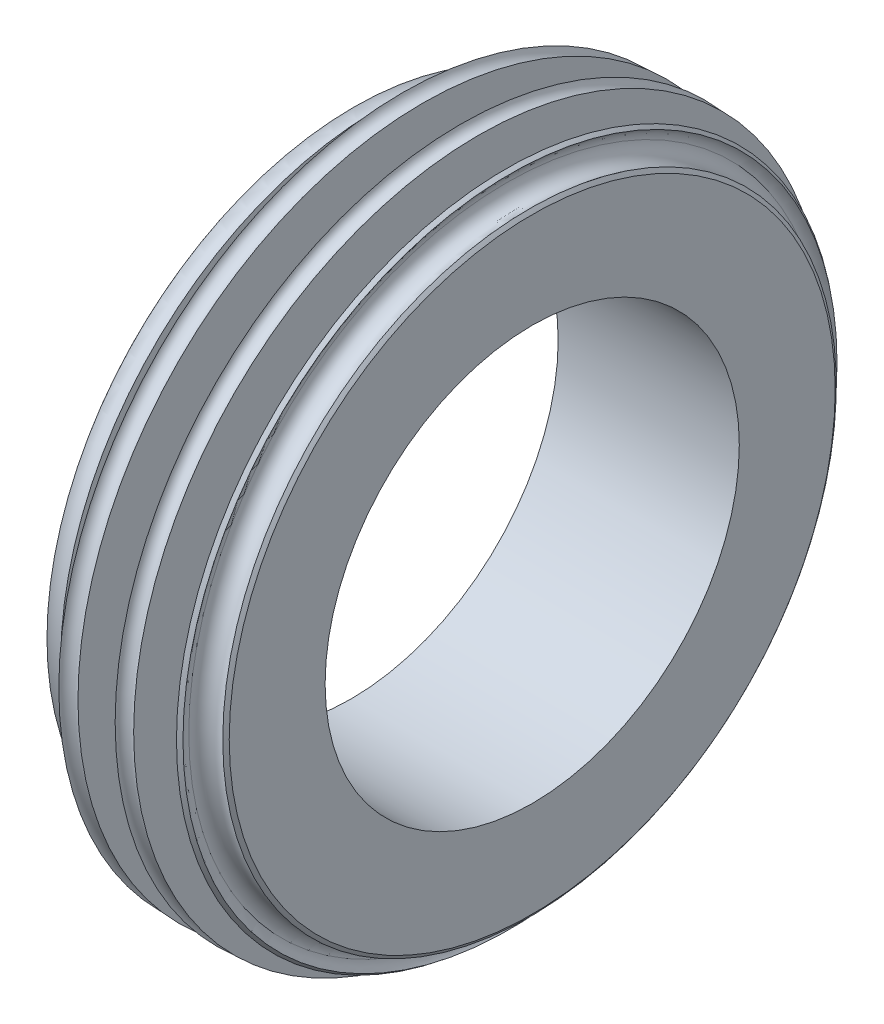
ISO-10303-21;
HEADER;
FILE_DESCRIPTION(('STEP AP214'),'2;1');
FILE_NAME('part.step','',(''),(''),'','','');
FILE_SCHEMA(('AUTOMOTIVE_DESIGN { 1 0 10303 214 1 1 1 1 }'));
ENDSEC;
DATA;
#1=APPLICATION_CONTEXT('core data for automotive mechanical design processes');
#2=APPLICATION_PROTOCOL_DEFINITION('international standard','automotive_design',2000,#1);
#3=PRODUCT_CONTEXT('',#1,'mechanical');
#4=PRODUCT('Part','Part','',(#3));
#5=PRODUCT_RELATED_PRODUCT_CATEGORY('part','',(#4));
#6=PRODUCT_DEFINITION_FORMATION('','',#4);
#7=PRODUCT_DEFINITION_CONTEXT('part definition',#1,'design');
#8=PRODUCT_DEFINITION('design','',#6,#7);
#9=PRODUCT_DEFINITION_SHAPE('','',#8);
#10=(LENGTH_UNIT() NAMED_UNIT(*) SI_UNIT(.MILLI.,.METRE.));
#11=(NAMED_UNIT(*) PLANE_ANGLE_UNIT() SI_UNIT($,.RADIAN.));
#12=(NAMED_UNIT(*) SI_UNIT($,.STERADIAN.) SOLID_ANGLE_UNIT());
#13=UNCERTAINTY_MEASURE_WITH_UNIT(LENGTH_MEASURE(1.E-05),#10,'distance_accuracy_value','');
#14=(GEOMETRIC_REPRESENTATION_CONTEXT(3) GLOBAL_UNCERTAINTY_ASSIGNED_CONTEXT((#13)) GLOBAL_UNIT_ASSIGNED_CONTEXT((#10,
#11,#12)) REPRESENTATION_CONTEXT('',''));
#15=CARTESIAN_POINT('',(0.,0.,0.));
#16=DIRECTION('',(0.,0.,1.));
#17=DIRECTION('',(1.,0.,0.));
#18=AXIS2_PLACEMENT_3D('',#15,#16,#17);
#19=CARTESIAN_POINT('',(0.,0.,0.));
#20=DIRECTION('',(-1.,0.,0.));
#21=DIRECTION('',(0.,0.,1.));
#22=AXIS2_PLACEMENT_3D('',#19,#20,#21);
#23=TOROIDAL_SURFACE('',#22,35.0374357794648,15.8674307799022);
#24=CARTESIAN_POINT('',(13.1340085427042,0.,0.));
#25=DIRECTION('',(-1.,0.,0.));
#26=DIRECTION('',(0.,0.,1.));
#27=AXIS2_PLACEMENT_3D('',#24,#25,#26);
#28=CIRCLE('',#27,43.9409844627236);
#29=CARTESIAN_POINT('',(13.1340085427042,0.,43.9409844627236));
#30=VERTEX_POINT('',#29);
#31=EDGE_CURVE('E166',#30,#30,#28,.T.);
#32=ORIENTED_EDGE('',*,*,#31,.T.);
#33=EDGE_LOOP('',(#32));
#34=FACE_BOUND('',#33,.T.);
#35=CARTESIAN_POINT('',(12.7450342179756,0.,0.));
#36=DIRECTION('',(-1.,0.,0.));
#37=DIRECTION('',(0.,0.,1.));
#38=AXIS2_PLACEMENT_3D('',#35,#36,#37);
#39=CIRCLE('',#38,44.4893912563816);
#40=CARTESIAN_POINT('',(12.7450342179756,0.,44.4893912563816));
#41=VERTEX_POINT('',#40);
#42=EDGE_CURVE('E66',#41,#41,#39,.T.);
#43=ORIENTED_EDGE('',*,*,#42,.F.);
#44=EDGE_LOOP('',(#43));
#45=FACE_BOUND('',#44,.T.);
#46=ADVANCED_FACE('F45',(#34,#45),#23,.T.);
#47=CARTESIAN_POINT('',(-13.1340085427042,0.,0.));
#48=DIRECTION('',(-1.,0.,0.));
#49=DIRECTION('',(0.,0.,1.));
#50=AXIS2_PLACEMENT_3D('',#47,#48,#49);
#51=CIRCLE('',#50,43.9409844627236);
#52=CARTESIAN_POINT('',(-13.1340085427042,0.,43.9409844627236));
#53=VERTEX_POINT('',#52);
#54=EDGE_CURVE('E162',#53,#53,#51,.T.);
#55=ORIENTED_EDGE('',*,*,#54,.F.);
#56=EDGE_LOOP('',(#55));
#57=FACE_BOUND('',#56,.T.);
#58=CARTESIAN_POINT('',(-12.7365126078752,0.,0.));
#59=DIRECTION('',(1.,0.,0.));
#60=DIRECTION('',(0.,0.,-1.));
#61=AXIS2_PLACEMENT_3D('',#58,#59,#60);
#62=CIRCLE('',#61,44.5008709984761);
#63=CARTESIAN_POINT('',(-12.7365126078752,0.,-44.5008709984761));
#64=VERTEX_POINT('',#63);
#65=EDGE_CURVE('E62',#64,#64,#62,.T.);
#66=ORIENTED_EDGE('',*,*,#65,.F.);
#67=EDGE_LOOP('',(#66));
#68=FACE_BOUND('',#67,.T.);
#69=ADVANCED_FACE('F92',(#57,#68),#23,.T.);
#70=CARTESIAN_POINT('',(13.1340085427042,30.0343871822133,0.));
#71=DIRECTION('',(-1.,0.,0.));
#72=DIRECTION('',(0.,0.,1.));
#73=AXIS2_PLACEMENT_3D('',#70,#71,#72);
#74=PLANE('',#73);
#75=ORIENTED_EDGE('',*,*,#31,.F.);
#76=EDGE_LOOP('',(#75));
#77=FACE_BOUND('',#76,.T.);
#78=CARTESIAN_POINT('',(13.1340085427042,0.,0.));
#79=DIRECTION('',(-1.,0.,0.));
#80=DIRECTION('',(0.,0.,1.));
#81=AXIS2_PLACEMENT_3D('',#78,#79,#80);
#82=CIRCLE('',#81,30.0343871822133);
#83=CARTESIAN_POINT('',(13.1340085427042,0.,30.0343871822133));
#84=VERTEX_POINT('',#83);
#85=EDGE_CURVE('E158',#84,#84,#82,.T.);
#86=ORIENTED_EDGE('',*,*,#85,.T.);
#87=EDGE_LOOP('',(#86));
#88=FACE_BOUND('',#87,.T.);
#89=ADVANCED_FACE('F94',(#77,#88),#74,.F.);
#90=CARTESIAN_POINT('',(-37.2774065991457,0.,0.));
#91=DIRECTION('',(-1.,0.,0.));
#92=DIRECTION('',(0.,0.,1.));
#93=AXIS2_PLACEMENT_3D('',#90,#91,#92);
#94=CYLINDRICAL_SURFACE('',#93,30.0343871822133);
#95=ORIENTED_EDGE('',*,*,#85,.F.);
#96=EDGE_LOOP('',(#95));
#97=FACE_BOUND('',#96,.T.);
#98=CARTESIAN_POINT('',(-13.1340085427042,0.,0.));
#99=DIRECTION('',(-1.,0.,0.));
#100=DIRECTION('',(0.,0.,1.));
#101=AXIS2_PLACEMENT_3D('',#98,#99,#100);
#102=CIRCLE('',#101,30.0343871822133);
#103=CARTESIAN_POINT('',(-13.1340085427042,0.,30.0343871822133));
#104=VERTEX_POINT('',#103);
#105=EDGE_CURVE('E161',#104,#104,#102,.T.);
#106=ORIENTED_EDGE('',*,*,#105,.T.);
#107=EDGE_LOOP('',(#106));
#108=FACE_BOUND('',#107,.T.);
#109=ADVANCED_FACE('F100',(#97,#108),#94,.F.);
#110=CARTESIAN_POINT('',(-13.1340085427042,30.0343871822133,0.));
#111=DIRECTION('',(1.,0.,0.));
#112=DIRECTION('',(0.,0.,-1.));
#113=AXIS2_PLACEMENT_3D('',#110,#111,#112);
#114=PLANE('',#113);
#115=ORIENTED_EDGE('',*,*,#105,.F.);
#116=EDGE_LOOP('',(#115));
#117=FACE_BOUND('',#116,.T.);
#118=ORIENTED_EDGE('',*,*,#54,.T.);
#119=EDGE_LOOP('',(#118));
#120=FACE_BOUND('',#119,.T.);
#121=ADVANCED_FACE('F147',(#117,#120),#114,.F.);
#122=CARTESIAN_POINT('',(11.4232797870954,0.,0.));
#123=DIRECTION('',(-1.,0.,0.));
#124=DIRECTION('',(0.,0.,1.));
#125=AXIS2_PLACEMENT_3D('',#122,#123,#124);
#126=TOROIDAL_SURFACE('',#125,46.0503390506609,2.04538328731251);
#127=CARTESIAN_POINT('',(9.37789649978293,0.,0.));
#128=DIRECTION('',(-1.,0.,0.));
#129=DIRECTION('',(0.,0.,1.));
#130=AXIS2_PLACEMENT_3D('',#127,#128,#129);
#131=CIRCLE('',#130,46.0503390506609);
#132=CARTESIAN_POINT('',(9.37789649978293,0.,46.0503390506609));
#133=VERTEX_POINT('',#132);
#134=EDGE_CURVE('E49',#133,#133,#131,.F.);
#135=ORIENTED_EDGE('',*,*,#134,.T.);
#136=EDGE_LOOP('',(#135));
#137=FACE_BOUND('',#136,.T.);
#138=ORIENTED_EDGE('',*,*,#42,.T.);
#139=EDGE_LOOP('',(#138));
#140=FACE_BOUND('',#139,.T.);
#141=ADVANCED_FACE('F47',(#137,#140),#126,.F.);
#142=CARTESIAN_POINT('',(-11.2760552877462,0.,0.));
#143=DIRECTION('',(-1.,0.,0.));
#144=DIRECTION('',(0.,0.,1.));
#145=AXIS2_PLACEMENT_3D('',#142,#143,#144);
#146=TOROIDAL_SURFACE('',#145,46.2010345138639,2.24131469521227);
#147=CARTESIAN_POINT('',(-9.03474059253394,0.,0.));
#148=DIRECTION('',(-1.,0.,0.));
#149=DIRECTION('',(0.,0.,1.));
#150=AXIS2_PLACEMENT_3D('',#147,#148,#149);
#151=CIRCLE('',#150,46.2010345138639);
#152=CARTESIAN_POINT('',(-9.03474059253394,0.,46.2010345138639));
#153=VERTEX_POINT('',#152);
#154=EDGE_CURVE('E58',#153,#153,#151,.F.);
#155=ORIENTED_EDGE('',*,*,#154,.F.);
#156=EDGE_LOOP('',(#155));
#157=FACE_BOUND('',#156,.T.);
#158=ORIENTED_EDGE('',*,*,#65,.T.);
#159=EDGE_LOOP('',(#158));
#160=FACE_BOUND('',#159,.T.);
#161=ADVANCED_FACE('F85',(#157,#160),#146,.F.);
#162=CARTESIAN_POINT('',(9.37789649978293,56.8729581418013,0.));
#163=DIRECTION('',(1.,0.,0.));
#164=DIRECTION('',(0.,0.,-1.));
#165=AXIS2_PLACEMENT_3D('',#162,#163,#164);
#166=PLANE('',#165);
#167=CARTESIAN_POINT('',(9.37789649978293,0.,0.));
#168=DIRECTION('',(1.,0.,0.));
#169=DIRECTION('',(0.,0.,-1.));
#170=AXIS2_PLACEMENT_3D('',#167,#168,#169);
#171=CIRCLE('',#170,41.3285044661054);
#172=CARTESIAN_POINT('',(9.37789649978293,0.,-41.3285044661054));
#173=VERTEX_POINT('',#172);
#174=EDGE_CURVE('E65',#173,#173,#171,.T.);
#175=ORIENTED_EDGE('',*,*,#174,.T.);
#176=EDGE_LOOP('',(#175));
#177=FACE_BOUND('',#176,.T.);
#178=ORIENTED_EDGE('',*,*,#134,.F.);
#179=EDGE_LOOP('',(#178));
#180=FACE_BOUND('',#179,.T.);
#181=ADVANCED_FACE('F88',(#177,#180),#166,.F.);
#182=CARTESIAN_POINT('',(30.0261418842836,0.,0.));
#183=DIRECTION('',(1.,0.,0.));
#184=DIRECTION('',(0.,0.,-1.));
#185=AXIS2_PLACEMENT_3D('',#182,#183,#184);
#186=CYLINDRICAL_SURFACE('',#185,41.3285044661054);
#187=ORIENTED_EDGE('',*,*,#174,.F.);
#188=EDGE_LOOP('',(#187));
#189=FACE_BOUND('',#188,.T.);
#190=CARTESIAN_POINT('',(5.31891656235881,0.,0.));
#191=DIRECTION('',(1.,0.,0.));
#192=DIRECTION('',(0.,0.,-1.));
#193=AXIS2_PLACEMENT_3D('',#190,#191,#192);
#194=CIRCLE('',#193,41.3285044661054);
#195=CARTESIAN_POINT('',(5.31891656235881,0.,-41.3285044661054));
#196=VERTEX_POINT('',#195);
#197=EDGE_CURVE('E79',#196,#196,#194,.T.);
#198=ORIENTED_EDGE('',*,*,#197,.T.);
#199=EDGE_LOOP('',(#198));
#200=FACE_BOUND('',#199,.T.);
#201=ADVANCED_FACE('F107',(#189,#200),#186,.T.);
#202=CARTESIAN_POINT('',(5.31891656235881,56.8729581418013,0.));
#203=DIRECTION('',(-1.,0.,0.));
#204=DIRECTION('',(0.,0.,1.));
#205=AXIS2_PLACEMENT_3D('',#202,#203,#204);
#206=PLANE('',#205);
#207=ORIENTED_EDGE('',*,*,#197,.F.);
#208=EDGE_LOOP('',(#207));
#209=FACE_BOUND('',#208,.T.);
#210=CARTESIAN_POINT('',(5.31891656236198,0.,0.));
#211=DIRECTION('',(-1.,0.,0.));
#212=DIRECTION('',(0.,0.,1.));
#213=AXIS2_PLACEMENT_3D('',#210,#211,#212);
#214=CIRCLE('',#213,49.9868332976802);
#215=CARTESIAN_POINT('',(5.31891656236198,0.,49.9868332976802));
#216=VERTEX_POINT('',#215);
#217=EDGE_CURVE('E77',#216,#216,#214,.T.);
#218=ORIENTED_EDGE('',*,*,#217,.F.);
#219=EDGE_LOOP('',(#218));
#220=FACE_BOUND('',#219,.T.);
#221=ADVANCED_FACE('F119',(#209,#220),#206,.F.);
#222=CARTESIAN_POINT('',(4.04633905248665,0.,0.));
#223=DIRECTION('',(-1.,0.,0.));
#224=DIRECTION('',(0.,0.,1.));
#225=AXIS2_PLACEMENT_3D('',#222,#223,#224);
#226=TOROIDAL_SURFACE('',#225,50.3802679765302,1.33200764455522);
#227=ORIENTED_EDGE('',*,*,#217,.T.);
#228=EDGE_LOOP('',(#227));
#229=FACE_BOUND('',#228,.T.);
#230=CARTESIAN_POINT('',(2.74524725799163,0.,0.));
#231=DIRECTION('',(-1.,0.,0.));
#232=DIRECTION('',(0.,0.,1.));
#233=AXIS2_PLACEMENT_3D('',#230,#231,#232);
#234=CIRCLE('',#233,50.0949532249816);
#235=CARTESIAN_POINT('',(2.74524725799163,0.,50.0949532249816));
#236=VERTEX_POINT('',#235);
#237=EDGE_CURVE('E73',#236,#236,#234,.F.);
#238=ORIENTED_EDGE('',*,*,#237,.T.);
#239=EDGE_LOOP('',(#238));
#240=FACE_BOUND('',#239,.T.);
#241=ADVANCED_FACE('F115',(#229,#240),#226,.F.);
#242=CARTESIAN_POINT('',(2.74524725799163,41.3285044661054,0.));
#243=DIRECTION('',(1.,0.,0.));
#244=DIRECTION('',(0.,0.,-1.));
#245=AXIS2_PLACEMENT_3D('',#242,#243,#244);
#246=PLANE('',#245);
#247=CARTESIAN_POINT('',(2.74524725799163,0.,0.));
#248=DIRECTION('',(1.,0.,0.));
#249=DIRECTION('',(0.,0.,-1.));
#250=AXIS2_PLACEMENT_3D('',#247,#248,#249);
#251=CIRCLE('',#250,41.3285044661054);
#252=CARTESIAN_POINT('',(2.74524725799163,0.,-41.3285044661054));
#253=VERTEX_POINT('',#252);
#254=EDGE_CURVE('E76',#253,#253,#251,.T.);
#255=ORIENTED_EDGE('',*,*,#254,.T.);
#256=EDGE_LOOP('',(#255));
#257=FACE_BOUND('',#256,.T.);
#258=ORIENTED_EDGE('',*,*,#237,.F.);
#259=EDGE_LOOP('',(#258));
#260=FACE_BOUND('',#259,.T.);
#261=ADVANCED_FACE('F118',(#257,#260),#246,.F.);
#262=CARTESIAN_POINT('',(30.0261418842836,0.,0.));
#263=DIRECTION('',(1.,0.,0.));
#264=DIRECTION('',(0.,0.,-1.));
#265=AXIS2_PLACEMENT_3D('',#262,#263,#264);
#266=CYLINDRICAL_SURFACE('',#265,41.3285044661054);
#267=ORIENTED_EDGE('',*,*,#254,.F.);
#268=EDGE_LOOP('',(#267));
#269=FACE_BOUND('',#268,.T.);
#270=CARTESIAN_POINT('',(-2.74524725799163,0.,0.));
#271=DIRECTION('',(1.,0.,0.));
#272=DIRECTION('',(0.,0.,-1.));
#273=AXIS2_PLACEMENT_3D('',#270,#271,#272);
#274=CIRCLE('',#273,41.3285044661054);
#275=CARTESIAN_POINT('',(-2.74524725799163,0.,-41.3285044661054));
#276=VERTEX_POINT('',#275);
#277=EDGE_CURVE('E172',#276,#276,#274,.T.);
#278=ORIENTED_EDGE('',*,*,#277,.T.);
#279=EDGE_LOOP('',(#278));
#280=FACE_BOUND('',#279,.T.);
#281=ADVANCED_FACE('F139',(#269,#280),#266,.T.);
#282=CARTESIAN_POINT('',(-2.74524725799163,41.3285044661054,0.));
#283=DIRECTION('',(-1.,0.,0.));
#284=DIRECTION('',(0.,0.,1.));
#285=AXIS2_PLACEMENT_3D('',#282,#283,#284);
#286=PLANE('',#285);
#287=ORIENTED_EDGE('',*,*,#277,.F.);
#288=EDGE_LOOP('',(#287));
#289=FACE_BOUND('',#288,.T.);
#290=CARTESIAN_POINT('',(-2.74524725799163,0.,0.));
#291=DIRECTION('',(1.,0.,0.));
#292=DIRECTION('',(0.,0.,-1.));
#293=AXIS2_PLACEMENT_3D('',#290,#291,#292);
#294=CIRCLE('',#293,49.9996447970624);
#295=CARTESIAN_POINT('',(-2.74524725799163,0.,-49.9996447970624));
#296=VERTEX_POINT('',#295);
#297=EDGE_CURVE('E72',#296,#296,#294,.F.);
#298=ORIENTED_EDGE('',*,*,#297,.F.);
#299=EDGE_LOOP('',(#298));
#300=FACE_BOUND('',#299,.T.);
#301=ADVANCED_FACE('F123',(#289,#300),#286,.F.);
#302=CARTESIAN_POINT('',(-4.2229006642473,0.,0.));
#303=DIRECTION('',(-1.,0.,0.));
#304=DIRECTION('',(0.,0.,1.));
#305=AXIS2_PLACEMENT_3D('',#302,#303,#304);
#306=TOROIDAL_SURFACE('',#305,50.3326137625706,1.51470390539227);
#307=ORIENTED_EDGE('',*,*,#297,.T.);
#308=EDGE_LOOP('',(#307));
#309=FACE_BOUND('',#308,.T.);
#310=CARTESIAN_POINT('',(-5.66207246960613,0.,0.));
#311=DIRECTION('',(1.,0.,0.));
#312=DIRECTION('',(0.,0.,-1.));
#313=AXIS2_PLACEMENT_3D('',#310,#311,#312);
#314=CIRCLE('',#313,49.8602659715674);
#315=CARTESIAN_POINT('',(-5.66207246960613,0.,-49.8602659715674));
#316=VERTEX_POINT('',#315);
#317=EDGE_CURVE('E69',#316,#316,#314,.T.);
#318=ORIENTED_EDGE('',*,*,#317,.T.);
#319=EDGE_LOOP('',(#318));
#320=FACE_BOUND('',#319,.T.);
#321=ADVANCED_FACE('F113',(#309,#320),#306,.F.);
#322=CARTESIAN_POINT('',(-9.03474059253394,56.8729581418013,0.));
#323=DIRECTION('',(-1.,0.,0.));
#324=DIRECTION('',(0.,0.,1.));
#325=AXIS2_PLACEMENT_3D('',#322,#323,#324);
#326=PLANE('',#325);
#327=CARTESIAN_POINT('',(-9.03474059253394,0.,0.));
#328=DIRECTION('',(1.,0.,0.));
#329=DIRECTION('',(0.,0.,-1.));
#330=AXIS2_PLACEMENT_3D('',#327,#328,#329);
#331=CIRCLE('',#330,41.3285044661054);
#332=CARTESIAN_POINT('',(-9.03474059253394,0.,-41.3285044661054));
#333=VERTEX_POINT('',#332);
#334=EDGE_CURVE('E53',#333,#333,#331,.T.);
#335=ORIENTED_EDGE('',*,*,#334,.F.);
#336=EDGE_LOOP('',(#335));
#337=FACE_BOUND('',#336,.T.);
#338=ORIENTED_EDGE('',*,*,#154,.T.);
#339=EDGE_LOOP('',(#338));
#340=FACE_BOUND('',#339,.T.);
#341=ADVANCED_FACE('F83',(#337,#340),#326,.F.);
#342=CARTESIAN_POINT('',(30.0261418842836,0.,0.));
#343=DIRECTION('',(1.,0.,0.));
#344=DIRECTION('',(0.,0.,-1.));
#345=AXIS2_PLACEMENT_3D('',#342,#343,#344);
#346=CYLINDRICAL_SURFACE('',#345,41.3285044661054);
#347=CARTESIAN_POINT('',(-5.66207246960779,0.,0.));
#348=DIRECTION('',(1.,0.,0.));
#349=DIRECTION('',(0.,0.,-1.));
#350=AXIS2_PLACEMENT_3D('',#347,#348,#349);
#351=CIRCLE('',#350,41.3285044661054);
#352=CARTESIAN_POINT('',(-5.66207246960779,0.,-41.3285044661054));
#353=VERTEX_POINT('',#352);
#354=EDGE_CURVE('E11',#353,#353,#351,.T.);
#355=ORIENTED_EDGE('',*,*,#354,.F.);
#356=EDGE_LOOP('',(#355));
#357=FACE_BOUND('',#356,.T.);
#358=ORIENTED_EDGE('',*,*,#334,.T.);
#359=EDGE_LOOP('',(#358));
#360=FACE_BOUND('',#359,.T.);
#361=ADVANCED_FACE('F112',(#357,#360),#346,.T.);
#362=CARTESIAN_POINT('',(-5.66207246960779,56.8729581418013,0.));
#363=DIRECTION('',(1.,0.,0.));
#364=DIRECTION('',(0.,0.,-1.));
#365=AXIS2_PLACEMENT_3D('',#362,#363,#364);
#366=PLANE('',#365);
#367=ORIENTED_EDGE('',*,*,#354,.T.);
#368=EDGE_LOOP('',(#367));
#369=FACE_BOUND('',#368,.T.);
#370=ORIENTED_EDGE('',*,*,#317,.F.);
#371=EDGE_LOOP('',(#370));
#372=FACE_BOUND('',#371,.T.);
#373=ADVANCED_FACE('F127',(#369,#372),#366,.F.);
#374=CLOSED_SHELL('',(#46,#69,#89,#109,#121,#141,#161,#181,#201,#221,#241,#261,#281,#301,#321,
#341,#361,#373));
#375=MANIFOLD_SOLID_BREP('B2',#374);
#376=CARTESIAN_POINT('',(9.37789649978293,56.8729581418013,0.));
#377=DIRECTION('',(1.,0.,0.));
#378=DIRECTION('',(0.,0.,-1.));
#379=AXIS2_PLACEMENT_3D('',#376,#377,#378);
#380=PLANE('',#379);
#381=CARTESIAN_POINT('',(9.37789649978293,0.,0.));
#382=DIRECTION('',(-1.,0.,0.));
#383=DIRECTION('',(0.,0.,1.));
#384=AXIS2_PLACEMENT_3D('',#381,#382,#383);
#385=CIRCLE('',#384,46.0503390506609);
#386=CARTESIAN_POINT('',(9.37789649978293,0.,46.0503390506609));
#387=VERTEX_POINT('',#386);
#388=EDGE_CURVE('E320',#387,#387,#385,.F.);
#389=ORIENTED_EDGE('',*,*,#388,.T.);
#390=EDGE_LOOP('',(#389));
#391=FACE_BOUND('',#390,.T.);
#392=CARTESIAN_POINT('',(9.37789649978293,0.,0.));
#393=DIRECTION('',(1.,0.,0.));
#394=DIRECTION('',(0.,0.,-1.));
#395=AXIS2_PLACEMENT_3D('',#392,#393,#394);
#396=CIRCLE('',#395,47.8370614300198);
#397=CARTESIAN_POINT('',(9.37789649978293,0.,-47.8370614300198));
#398=VERTEX_POINT('',#397);
#399=EDGE_CURVE('E324',#398,#398,#396,.T.);
#400=ORIENTED_EDGE('',*,*,#399,.F.);
#401=EDGE_LOOP('',(#400));
#402=FACE_BOUND('',#401,.T.);
#403=ADVANCED_FACE('F316',(#391,#402),#380,.F.);
#404=CARTESIAN_POINT('',(0.,0.,0.));
#405=DIRECTION('',(-1.,0.,0.));
#406=DIRECTION('',(0.,0.,1.));
#407=AXIS2_PLACEMENT_3D('',#404,#405,#406);
#408=TOROIDAL_SURFACE('',#407,35.0374357794648,15.8674307799022);
#409=ORIENTED_EDGE('',*,*,#399,.T.);
#410=EDGE_LOOP('',(#409));
#411=FACE_BOUND('',#410,.T.);
#412=CARTESIAN_POINT('',(9.91171190082809,0.,0.));
#413=DIRECTION('',(1.,0.,0.));
#414=DIRECTION('',(0.,0.,-1.));
#415=AXIS2_PLACEMENT_3D('',#412,#413,#414);
#416=CIRCLE('',#415,47.4282923580056);
#417=CARTESIAN_POINT('',(9.91171190082809,0.,-47.4282923580056));
#418=VERTEX_POINT('',#417);
#419=EDGE_CURVE('E44',#418,#418,#416,.T.);
#420=ORIENTED_EDGE('',*,*,#419,.F.);
#421=EDGE_LOOP('',(#420));
#422=FACE_BOUND('',#421,.T.);
#423=ADVANCED_FACE('F337',(#411,#422),#408,.T.);
#424=CARTESIAN_POINT('',(11.4232797870954,0.,0.));
#425=DIRECTION('',(-1.,0.,0.));
#426=DIRECTION('',(0.,0.,1.));
#427=AXIS2_PLACEMENT_3D('',#424,#425,#426);
#428=TOROIDAL_SURFACE('',#427,46.0503390506609,2.04538328731251);
#429=ORIENTED_EDGE('',*,*,#388,.F.);
#430=EDGE_LOOP('',(#429));
#431=FACE_BOUND('',#430,.T.);
#432=ORIENTED_EDGE('',*,*,#419,.T.);
#433=EDGE_LOOP('',(#432));
#434=FACE_BOUND('',#433,.T.);
#435=ADVANCED_FACE('F318',(#431,#434),#428,.F.);
#436=CLOSED_SHELL('',(#403,#423,#435));
#437=MANIFOLD_SOLID_BREP('B6',#436);
#438=ADVANCED_BREP_SHAPE_REPRESENTATION('',(#18,#375,#437),#14);
#439=SHAPE_DEFINITION_REPRESENTATION(#9,#438);
ENDSEC;
END-ISO-10303-21;
